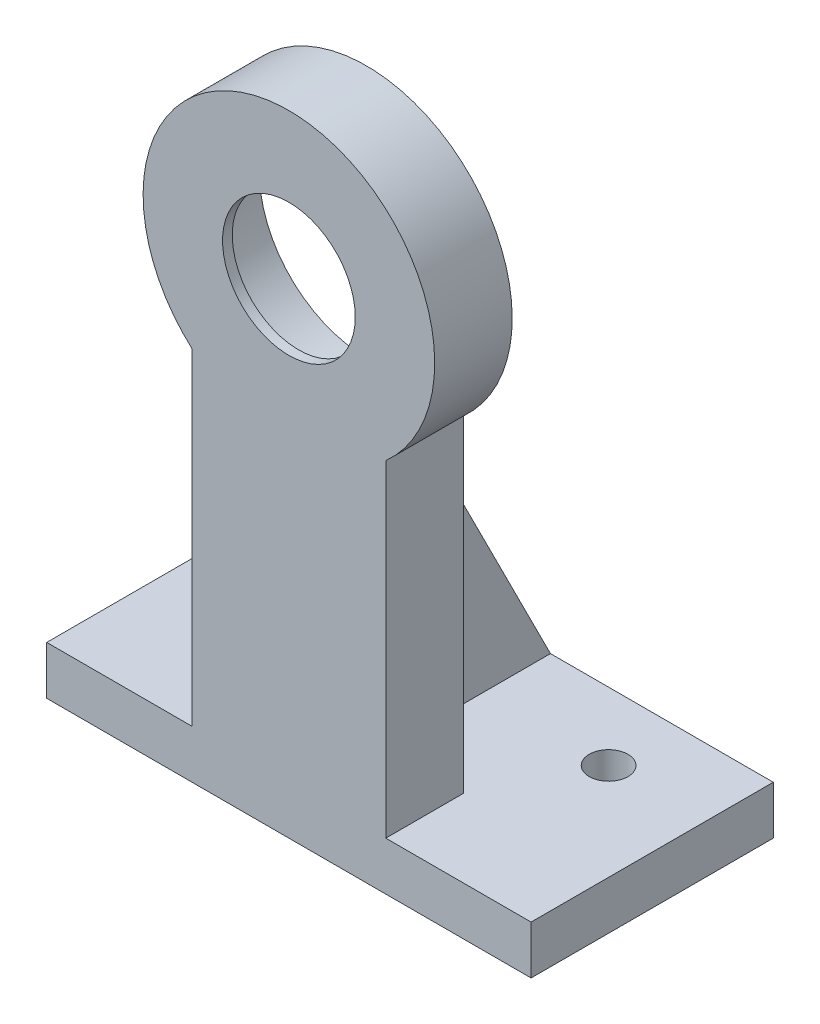
ISO-10303-21;
HEADER;
FILE_DESCRIPTION(('STEP AP214'),'2;1');
FILE_NAME('part.step','',(''),(''),'','','');
FILE_SCHEMA(('AUTOMOTIVE_DESIGN { 1 0 10303 214 1 1 1 1 }'));
ENDSEC;
DATA;
#1=APPLICATION_CONTEXT('core data for automotive mechanical design processes');
#2=APPLICATION_PROTOCOL_DEFINITION('international standard','automotive_design',2000,#1);
#3=PRODUCT_CONTEXT('',#1,'mechanical');
#4=PRODUCT('Part','Part','',(#3));
#5=PRODUCT_RELATED_PRODUCT_CATEGORY('part','',(#4));
#6=PRODUCT_DEFINITION_FORMATION('','',#4);
#7=PRODUCT_DEFINITION_CONTEXT('part definition',#1,'design');
#8=PRODUCT_DEFINITION('design','',#6,#7);
#9=PRODUCT_DEFINITION_SHAPE('','',#8);
#10=(LENGTH_UNIT() NAMED_UNIT(*) SI_UNIT(.MILLI.,.METRE.));
#11=(NAMED_UNIT(*) PLANE_ANGLE_UNIT() SI_UNIT($,.RADIAN.));
#12=(NAMED_UNIT(*) SI_UNIT($,.STERADIAN.) SOLID_ANGLE_UNIT());
#13=UNCERTAINTY_MEASURE_WITH_UNIT(LENGTH_MEASURE(1.E-05),#10,'distance_accuracy_value','');
#14=(GEOMETRIC_REPRESENTATION_CONTEXT(3) GLOBAL_UNCERTAINTY_ASSIGNED_CONTEXT((#13)) GLOBAL_UNIT_ASSIGNED_CONTEXT((#10,
#11,#12)) REPRESENTATION_CONTEXT('',''));
#15=CARTESIAN_POINT('',(0.,0.,0.));
#16=DIRECTION('',(0.,0.,1.));
#17=DIRECTION('',(1.,0.,0.));
#18=AXIS2_PLACEMENT_3D('',#15,#16,#17);
#19=CARTESIAN_POINT('',(0.,0.,0.));
#20=DIRECTION('',(0.,0.,1.));
#21=DIRECTION('',(1.,0.,0.));
#22=AXIS2_PLACEMENT_3D('',#19,#20,#21);
#23=PLANE('',#22);
#24=CARTESIAN_POINT('',(0.,0.,0.));
#25=DIRECTION('',(0.,0.,1.));
#26=DIRECTION('',(1.,0.,0.));
#27=AXIS2_PLACEMENT_3D('',#24,#25,#26);
#28=CIRCLE('',#27,11.05);
#29=CARTESIAN_POINT('',(11.05,0.,0.));
#30=VERTEX_POINT('',#29);
#31=EDGE_CURVE('E152',#30,#30,#28,.T.);
#32=ORIENTED_EDGE('',*,*,#31,.T.);
#33=EDGE_LOOP('',(#32));
#34=FACE_BOUND('',#33,.T.);
#35=DIRECTION('',(0.,-1.,0.));
#36=VECTOR('',#35,1.);
#37=CARTESIAN_POINT('',(-2.,-45.,0.));
#38=LINE('',#37,#36);
#39=CARTESIAN_POINT('',(-2.,-11.247333017209,0.));
#40=VERTEX_POINT('',#39);
#41=CARTESIAN_POINT('',(-2.,-45.,0.));
#42=VERTEX_POINT('',#41);
#43=EDGE_CURVE('E276',#40,#42,#38,.T.);
#44=ORIENTED_EDGE('',*,*,#43,.T.);
#45=DIRECTION('',(-1.,0.,0.));
#46=VECTOR('',#45,1.);
#47=CARTESIAN_POINT('',(0.,-45.,0.));
#48=LINE('',#47,#46);
#49=CARTESIAN_POINT('',(-9.99999999999999,-45.,0.));
#50=VERTEX_POINT('',#49);
#51=EDGE_CURVE('E63',#42,#50,#48,.T.);
#52=ORIENTED_EDGE('',*,*,#51,.T.);
#53=DIRECTION('',(0.,-1.,0.));
#54=VECTOR('',#53,1.);
#55=CARTESIAN_POINT('',(-10.,0.,0.));
#56=LINE('',#55,#54);
#57=CARTESIAN_POINT('',(-10.,-11.247333017209,0.));
#58=VERTEX_POINT('',#57);
#59=EDGE_CURVE('E191',#58,#50,#56,.T.);
#60=ORIENTED_EDGE('',*,*,#59,.F.);
#61=CARTESIAN_POINT('',(0.,0.,0.));
#62=DIRECTION('',(0.,0.,1.));
#63=DIRECTION('',(1.,0.,0.));
#64=AXIS2_PLACEMENT_3D('',#61,#62,#63);
#65=CIRCLE('',#64,15.05);
#66=CARTESIAN_POINT('',(10.,-11.247333017209,0.));
#67=VERTEX_POINT('',#66);
#68=EDGE_CURVE('E166',#67,#58,#65,.T.);
#69=ORIENTED_EDGE('',*,*,#68,.F.);
#70=DIRECTION('',(0.,-1.,0.));
#71=VECTOR('',#70,1.);
#72=CARTESIAN_POINT('',(10.,0.,0.));
#73=LINE('',#72,#71);
#74=CARTESIAN_POINT('',(10.,-45.,0.));
#75=VERTEX_POINT('',#74);
#76=EDGE_CURVE('E146',#67,#75,#73,.T.);
#77=ORIENTED_EDGE('',*,*,#76,.T.);
#78=CARTESIAN_POINT('',(2.,-45.,0.));
#79=VERTEX_POINT('',#78);
#80=EDGE_CURVE('E137',#75,#79,#48,.T.);
#81=ORIENTED_EDGE('',*,*,#80,.T.);
#82=DIRECTION('',(0.,-1.,0.));
#83=VECTOR('',#82,1.);
#84=CARTESIAN_POINT('',(2.,-45.,0.));
#85=LINE('',#84,#83);
#86=CARTESIAN_POINT('',(2.,-11.247333017209,0.));
#87=VERTEX_POINT('',#86);
#88=EDGE_CURVE('E123',#87,#79,#85,.T.);
#89=ORIENTED_EDGE('',*,*,#88,.F.);
#90=DIRECTION('',(1.,0.,0.));
#91=VECTOR('',#90,1.);
#92=CARTESIAN_POINT('',(-2.,-11.247333017209,0.));
#93=LINE('',#92,#91);
#94=EDGE_CURVE('E286',#40,#87,#93,.T.);
#95=ORIENTED_EDGE('',*,*,#94,.F.);
#96=EDGE_LOOP('',(#44,#52,#60,#69,#77,#81,#89,#95));
#97=FACE_BOUND('',#96,.T.);
#98=ADVANCED_FACE('F39',(#34,#97),#23,.F.);
#99=CARTESIAN_POINT('',(0.,-45.,0.));
#100=DIRECTION('',(0.,1.,0.));
#101=DIRECTION('',(-1.,0.,0.));
#102=AXIS2_PLACEMENT_3D('',#99,#100,#101);
#103=PLANE('',#102);
#104=CARTESIAN_POINT('',(-15.,-45.,-10.));
#105=DIRECTION('',(0.,-1.,0.));
#106=DIRECTION('',(1.,0.,0.));
#107=AXIS2_PLACEMENT_3D('',#104,#105,#106);
#108=CIRCLE('',#107,2.);
#109=CARTESIAN_POINT('',(-13.,-45.,-10.));
#110=VERTEX_POINT('',#109);
#111=EDGE_CURVE('E242',#110,#110,#108,.T.);
#112=ORIENTED_EDGE('',*,*,#111,.T.);
#113=EDGE_LOOP('',(#112));
#114=FACE_BOUND('',#113,.T.);
#115=ORIENTED_EDGE('',*,*,#51,.F.);
#116=DIRECTION('',(0.,0.,-1.));
#117=VECTOR('',#116,1.);
#118=CARTESIAN_POINT('',(-2.,-45.,-17.));
#119=LINE('',#118,#117);
#120=CARTESIAN_POINT('',(-2.,-45.,-17.));
#121=VERTEX_POINT('',#120);
#122=EDGE_CURVE('E270',#42,#121,#119,.T.);
#123=ORIENTED_EDGE('',*,*,#122,.T.);
#124=DIRECTION('',(1.,0.,0.));
#125=VECTOR('',#124,1.);
#126=CARTESIAN_POINT('',(25.,-45.,-17.));
#127=LINE('',#126,#125);
#128=CARTESIAN_POINT('',(-25.,-45.,-17.));
#129=VERTEX_POINT('',#128);
#130=EDGE_CURVE('E226',#129,#121,#127,.T.);
#131=ORIENTED_EDGE('',*,*,#130,.F.);
#132=DIRECTION('',(0.,0.,-1.));
#133=VECTOR('',#132,1.);
#134=CARTESIAN_POINT('',(-25.,-45.,7.99999999999998));
#135=LINE('',#134,#133);
#136=CARTESIAN_POINT('',(-25.,-45.,7.99999999999998));
#137=VERTEX_POINT('',#136);
#138=EDGE_CURVE('E235',#137,#129,#135,.T.);
#139=ORIENTED_EDGE('',*,*,#138,.F.);
#140=DIRECTION('',(-1.,0.,0.));
#141=VECTOR('',#140,1.);
#142=CARTESIAN_POINT('',(25.,-45.,7.99999999999999));
#143=LINE('',#142,#141);
#144=CARTESIAN_POINT('',(-9.99999999999999,-45.,8.));
#145=VERTEX_POINT('',#144);
#146=EDGE_CURVE('E251',#145,#137,#143,.T.);
#147=ORIENTED_EDGE('',*,*,#146,.F.);
#148=DIRECTION('',(0.,0.,1.));
#149=VECTOR('',#148,1.);
#150=CARTESIAN_POINT('',(-9.99999999999999,-45.,8.));
#151=LINE('',#150,#149);
#152=EDGE_CURVE('E148',#50,#145,#151,.T.);
#153=ORIENTED_EDGE('',*,*,#152,.F.);
#154=EDGE_LOOP('',(#115,#123,#131,#139,#147,#153));
#155=FACE_BOUND('',#154,.T.);
#156=ADVANCED_FACE('F269',(#114,#155),#103,.T.);
#157=CARTESIAN_POINT('',(0.,0.,8.));
#158=DIRECTION('',(0.,0.,-1.));
#159=DIRECTION('',(-1.,0.,0.));
#160=AXIS2_PLACEMENT_3D('',#157,#158,#159);
#161=CYLINDRICAL_SURFACE('',#160,15.05);
#162=ORIENTED_EDGE('',*,*,#68,.T.);
#163=DIRECTION('',(0.,0.,-1.));
#164=VECTOR('',#163,1.);
#165=CARTESIAN_POINT('',(-10.,-11.247333017209,8.));
#166=LINE('',#165,#164);
#167=CARTESIAN_POINT('',(-10.,-11.247333017209,8.));
#168=VERTEX_POINT('',#167);
#169=EDGE_CURVE('E11',#168,#58,#166,.T.);
#170=ORIENTED_EDGE('',*,*,#169,.F.);
#171=CARTESIAN_POINT('',(0.,0.,8.));
#172=DIRECTION('',(0.,0.,1.));
#173=DIRECTION('',(1.,0.,0.));
#174=AXIS2_PLACEMENT_3D('',#171,#172,#173);
#175=CIRCLE('',#174,15.05);
#176=CARTESIAN_POINT('',(10.,-11.247333017209,8.));
#177=VERTEX_POINT('',#176);
#178=EDGE_CURVE('E174',#177,#168,#175,.T.);
#179=ORIENTED_EDGE('',*,*,#178,.F.);
#180=DIRECTION('',(0.,0.,-1.));
#181=VECTOR('',#180,1.);
#182=CARTESIAN_POINT('',(10.,-11.247333017209,8.));
#183=LINE('',#182,#181);
#184=EDGE_CURVE('E48',#177,#67,#183,.T.);
#185=ORIENTED_EDGE('',*,*,#184,.T.);
#186=EDGE_LOOP('',(#162,#170,#179,#185));
#187=FACE_BOUND('',#186,.T.);
#188=ADVANCED_FACE('F198',(#187),#161,.T.);
#189=CARTESIAN_POINT('',(-10.,0.,8.));
#190=DIRECTION('',(1.,0.,0.));
#191=DIRECTION('',(0.,1.,0.));
#192=AXIS2_PLACEMENT_3D('',#189,#190,#191);
#193=PLANE('',#192);
#194=ORIENTED_EDGE('',*,*,#59,.T.);
#195=ORIENTED_EDGE('',*,*,#152,.T.);
#196=DIRECTION('',(0.,-1.,0.));
#197=VECTOR('',#196,1.);
#198=CARTESIAN_POINT('',(-10.,0.,8.));
#199=LINE('',#198,#197);
#200=EDGE_CURVE('E178',#168,#145,#199,.T.);
#201=ORIENTED_EDGE('',*,*,#200,.F.);
#202=ORIENTED_EDGE('',*,*,#169,.T.);
#203=EDGE_LOOP('',(#194,#195,#201,#202));
#204=FACE_BOUND('',#203,.T.);
#205=ADVANCED_FACE('F310',(#204),#193,.F.);
#206=CARTESIAN_POINT('',(0.,-50.,8.));
#207=DIRECTION('',(0.,1.,0.));
#208=DIRECTION('',(-1.,0.,0.));
#209=AXIS2_PLACEMENT_3D('',#206,#207,#208);
#210=PLANE('',#209);
#211=DIRECTION('',(1.,0.,0.));
#212=VECTOR('',#211,1.);
#213=CARTESIAN_POINT('',(0.,-50.,8.));
#214=LINE('',#213,#212);
#215=CARTESIAN_POINT('',(-25.,-50.,7.99999999999998));
#216=VERTEX_POINT('',#215);
#217=CARTESIAN_POINT('',(25.,-50.,7.99999999999999));
#218=VERTEX_POINT('',#217);
#219=EDGE_CURVE('E182',#216,#218,#214,.T.);
#220=ORIENTED_EDGE('',*,*,#219,.F.);
#221=DIRECTION('',(0.,0.,-1.));
#222=VECTOR('',#221,1.);
#223=CARTESIAN_POINT('',(-25.,-50.,7.99999999999998));
#224=LINE('',#223,#222);
#225=CARTESIAN_POINT('',(-25.,-50.,-17.));
#226=VERTEX_POINT('',#225);
#227=EDGE_CURVE('E241',#216,#226,#224,.T.);
#228=ORIENTED_EDGE('',*,*,#227,.T.);
#229=DIRECTION('',(1.,0.,0.));
#230=VECTOR('',#229,1.);
#231=CARTESIAN_POINT('',(25.,-50.,-17.));
#232=LINE('',#231,#230);
#233=CARTESIAN_POINT('',(25.,-50.,-17.));
#234=VERTEX_POINT('',#233);
#235=EDGE_CURVE('E218',#226,#234,#232,.T.);
#236=ORIENTED_EDGE('',*,*,#235,.T.);
#237=DIRECTION('',(0.,0.,1.));
#238=VECTOR('',#237,1.);
#239=CARTESIAN_POINT('',(25.,-50.,7.99999999999999));
#240=LINE('',#239,#238);
#241=EDGE_CURVE('E239',#234,#218,#240,.T.);
#242=ORIENTED_EDGE('',*,*,#241,.T.);
#243=EDGE_LOOP('',(#220,#228,#236,#242));
#244=FACE_BOUND('',#243,.T.);
#245=CARTESIAN_POINT('',(15.,-50.,-10.));
#246=DIRECTION('',(0.,-1.,0.));
#247=DIRECTION('',(1.,0.,0.));
#248=AXIS2_PLACEMENT_3D('',#245,#246,#247);
#249=CIRCLE('',#248,2.00000000000001);
#250=CARTESIAN_POINT('',(17.,-50.,-10.));
#251=VERTEX_POINT('',#250);
#252=EDGE_CURVE('E289',#251,#251,#249,.T.);
#253=ORIENTED_EDGE('',*,*,#252,.F.);
#254=EDGE_LOOP('',(#253));
#255=FACE_BOUND('',#254,.T.);
#256=CARTESIAN_POINT('',(-15.,-50.,-10.));
#257=DIRECTION('',(0.,-1.,0.));
#258=DIRECTION('',(1.,0.,0.));
#259=AXIS2_PLACEMENT_3D('',#256,#257,#258);
#260=CIRCLE('',#259,2.);
#261=CARTESIAN_POINT('',(-13.,-50.,-10.));
#262=VERTEX_POINT('',#261);
#263=EDGE_CURVE('E256',#262,#262,#260,.T.);
#264=ORIENTED_EDGE('',*,*,#263,.F.);
#265=EDGE_LOOP('',(#264));
#266=FACE_BOUND('',#265,.T.);
#267=ADVANCED_FACE('F308',(#244,#255,#266),#210,.F.);
#268=CARTESIAN_POINT('',(0.,0.,8.));
#269=DIRECTION('',(0.,0.,-1.));
#270=DIRECTION('',(-1.,0.,0.));
#271=AXIS2_PLACEMENT_3D('',#268,#269,#270);
#272=CYLINDRICAL_SURFACE('',#271,6.84796729746906);
#273=CARTESIAN_POINT('',(0.,0.,7.));
#274=DIRECTION('',(0.,0.,1.));
#275=DIRECTION('',(1.,0.,0.));
#276=AXIS2_PLACEMENT_3D('',#273,#274,#275);
#277=CIRCLE('',#276,6.84796729746906);
#278=CARTESIAN_POINT('',(6.84796729746906,0.,7.));
#279=VERTEX_POINT('',#278);
#280=EDGE_CURVE('E162',#279,#279,#277,.T.);
#281=ORIENTED_EDGE('',*,*,#280,.F.);
#282=EDGE_LOOP('',(#281));
#283=FACE_BOUND('',#282,.T.);
#284=CARTESIAN_POINT('',(0.,0.,8.));
#285=DIRECTION('',(0.,0.,1.));
#286=DIRECTION('',(1.,0.,0.));
#287=AXIS2_PLACEMENT_3D('',#284,#285,#286);
#288=CIRCLE('',#287,6.84796729746906);
#289=CARTESIAN_POINT('',(6.84796729746906,0.,8.));
#290=VERTEX_POINT('',#289);
#291=EDGE_CURVE('E170',#290,#290,#288,.T.);
#292=ORIENTED_EDGE('',*,*,#291,.T.);
#293=EDGE_LOOP('',(#292));
#294=FACE_BOUND('',#293,.T.);
#295=ADVANCED_FACE('F41',(#283,#294),#272,.F.);
#296=CARTESIAN_POINT('',(10.,0.,8.));
#297=DIRECTION('',(1.,0.,0.));
#298=DIRECTION('',(0.,1.,0.));
#299=AXIS2_PLACEMENT_3D('',#296,#297,#298);
#300=PLANE('',#299);
#301=DIRECTION('',(0.,0.,1.));
#302=VECTOR('',#301,1.);
#303=CARTESIAN_POINT('',(10.,-45.,8.));
#304=LINE('',#303,#302);
#305=CARTESIAN_POINT('',(10.,-45.,8.));
#306=VERTEX_POINT('',#305);
#307=EDGE_CURVE('E154',#75,#306,#304,.T.);
#308=ORIENTED_EDGE('',*,*,#307,.F.);
#309=ORIENTED_EDGE('',*,*,#76,.F.);
#310=ORIENTED_EDGE('',*,*,#184,.F.);
#311=DIRECTION('',(0.,-1.,0.));
#312=VECTOR('',#311,1.);
#313=CARTESIAN_POINT('',(10.,0.,8.));
#314=LINE('',#313,#312);
#315=EDGE_CURVE('E185',#177,#306,#314,.T.);
#316=ORIENTED_EDGE('',*,*,#315,.T.);
#317=EDGE_LOOP('',(#308,#309,#310,#316));
#318=FACE_BOUND('',#317,.T.);
#319=ADVANCED_FACE('F202',(#318),#300,.T.);
#320=CARTESIAN_POINT('',(0.,0.,8.));
#321=DIRECTION('',(0.,0.,1.));
#322=DIRECTION('',(1.,0.,0.));
#323=AXIS2_PLACEMENT_3D('',#320,#321,#322);
#324=PLANE('',#323);
#325=ORIENTED_EDGE('',*,*,#200,.T.);
#326=ORIENTED_EDGE('',*,*,#146,.T.);
#327=DIRECTION('',(0.,-1.,0.));
#328=VECTOR('',#327,1.);
#329=CARTESIAN_POINT('',(-25.,-45.,7.99999999999998));
#330=LINE('',#329,#328);
#331=EDGE_CURVE('E215',#137,#216,#330,.T.);
#332=ORIENTED_EDGE('',*,*,#331,.T.);
#333=ORIENTED_EDGE('',*,*,#219,.T.);
#334=DIRECTION('',(0.,-1.,0.));
#335=VECTOR('',#334,1.);
#336=CARTESIAN_POINT('',(25.,-45.,7.99999999999999));
#337=LINE('',#336,#335);
#338=CARTESIAN_POINT('',(25.,-45.,7.99999999999999));
#339=VERTEX_POINT('',#338);
#340=EDGE_CURVE('E223',#339,#218,#337,.T.);
#341=ORIENTED_EDGE('',*,*,#340,.F.);
#342=EDGE_CURVE('E254',#339,#306,#143,.T.);
#343=ORIENTED_EDGE('',*,*,#342,.T.);
#344=ORIENTED_EDGE('',*,*,#315,.F.);
#345=ORIENTED_EDGE('',*,*,#178,.T.);
#346=EDGE_LOOP('',(#325,#326,#332,#333,#341,#343,#344,#345));
#347=FACE_BOUND('',#346,.T.);
#348=ORIENTED_EDGE('',*,*,#291,.F.);
#349=EDGE_LOOP('',(#348));
#350=FACE_BOUND('',#349,.T.);
#351=ADVANCED_FACE('F329',(#347,#350),#324,.T.);
#352=CARTESIAN_POINT('',(0.,0.,7.));
#353=DIRECTION('',(0.,0.,-1.));
#354=DIRECTION('',(-1.,0.,0.));
#355=AXIS2_PLACEMENT_3D('',#352,#353,#354);
#356=CYLINDRICAL_SURFACE('',#355,11.05);
#357=CARTESIAN_POINT('',(0.,0.,7.));
#358=DIRECTION('',(0.,0.,1.));
#359=DIRECTION('',(1.,0.,0.));
#360=AXIS2_PLACEMENT_3D('',#357,#358,#359);
#361=CIRCLE('',#360,11.05);
#362=CARTESIAN_POINT('',(11.05,0.,7.));
#363=VERTEX_POINT('',#362);
#364=EDGE_CURVE('E158',#363,#363,#361,.T.);
#365=ORIENTED_EDGE('',*,*,#364,.T.);
#366=EDGE_LOOP('',(#365));
#367=FACE_BOUND('',#366,.T.);
#368=ORIENTED_EDGE('',*,*,#31,.F.);
#369=EDGE_LOOP('',(#368));
#370=FACE_BOUND('',#369,.T.);
#371=ADVANCED_FACE('F335',(#367,#370),#356,.F.);
#372=CARTESIAN_POINT('',(0.,0.,7.));
#373=DIRECTION('',(0.,0.,1.));
#374=DIRECTION('',(1.,0.,0.));
#375=AXIS2_PLACEMENT_3D('',#372,#373,#374);
#376=PLANE('',#375);
#377=ORIENTED_EDGE('',*,*,#364,.F.);
#378=EDGE_LOOP('',(#377));
#379=FACE_BOUND('',#378,.T.);
#380=ORIENTED_EDGE('',*,*,#280,.T.);
#381=EDGE_LOOP('',(#380));
#382=FACE_BOUND('',#381,.T.);
#383=ADVANCED_FACE('F339',(#379,#382),#376,.F.);
#384=DIRECTION('',(0.,0.,-1.));
#385=VECTOR('',#384,1.);
#386=CARTESIAN_POINT('',(2.,-45.,-17.));
#387=LINE('',#386,#385);
#388=CARTESIAN_POINT('',(2.,-45.,-17.));
#389=VERTEX_POINT('',#388);
#390=EDGE_CURVE('E126',#79,#389,#387,.T.);
#391=ORIENTED_EDGE('',*,*,#390,.F.);
#392=ORIENTED_EDGE('',*,*,#80,.F.);
#393=ORIENTED_EDGE('',*,*,#307,.T.);
#394=ORIENTED_EDGE('',*,*,#342,.F.);
#395=DIRECTION('',(0.,0.,1.));
#396=VECTOR('',#395,1.);
#397=CARTESIAN_POINT('',(25.,-45.,7.99999999999999));
#398=LINE('',#397,#396);
#399=CARTESIAN_POINT('',(25.,-45.,-17.));
#400=VERTEX_POINT('',#399);
#401=EDGE_CURVE('E249',#400,#339,#398,.T.);
#402=ORIENTED_EDGE('',*,*,#401,.F.);
#403=EDGE_CURVE('E139',#389,#400,#127,.T.);
#404=ORIENTED_EDGE('',*,*,#403,.F.);
#405=EDGE_LOOP('',(#391,#392,#393,#394,#402,#404));
#406=FACE_BOUND('',#405,.T.);
#407=CARTESIAN_POINT('',(15.,-45.,-10.));
#408=DIRECTION('',(0.,-1.,0.));
#409=DIRECTION('',(1.,0.,0.));
#410=AXIS2_PLACEMENT_3D('',#407,#408,#409);
#411=CIRCLE('',#410,2.00000000000001);
#412=CARTESIAN_POINT('',(17.,-45.,-10.));
#413=VERTEX_POINT('',#412);
#414=EDGE_CURVE('E292',#413,#413,#411,.T.);
#415=ORIENTED_EDGE('',*,*,#414,.T.);
#416=EDGE_LOOP('',(#415));
#417=FACE_BOUND('',#416,.T.);
#418=ADVANCED_FACE('F134',(#406,#417),#103,.T.);
#419=CARTESIAN_POINT('',(25.,-45.,7.99999999999999));
#420=DIRECTION('',(1.,0.,0.));
#421=DIRECTION('',(0.,0.,-1.));
#422=AXIS2_PLACEMENT_3D('',#419,#420,#421);
#423=PLANE('',#422);
#424=ORIENTED_EDGE('',*,*,#241,.F.);
#425=DIRECTION('',(0.,-1.,0.));
#426=VECTOR('',#425,1.);
#427=CARTESIAN_POINT('',(25.,-45.,-17.));
#428=LINE('',#427,#426);
#429=EDGE_CURVE('E206',#400,#234,#428,.T.);
#430=ORIENTED_EDGE('',*,*,#429,.F.);
#431=ORIENTED_EDGE('',*,*,#401,.T.);
#432=ORIENTED_EDGE('',*,*,#340,.T.);
#433=EDGE_LOOP('',(#424,#430,#431,#432));
#434=FACE_BOUND('',#433,.T.);
#435=ADVANCED_FACE('F344',(#434),#423,.T.);
#436=CARTESIAN_POINT('',(25.,-45.,-17.));
#437=DIRECTION('',(0.,0.,-1.));
#438=DIRECTION('',(-1.,0.,0.));
#439=AXIS2_PLACEMENT_3D('',#436,#437,#438);
#440=PLANE('',#439);
#441=ORIENTED_EDGE('',*,*,#235,.F.);
#442=DIRECTION('',(0.,-1.,0.));
#443=VECTOR('',#442,1.);
#444=CARTESIAN_POINT('',(-25.,-45.,-17.));
#445=LINE('',#444,#443);
#446=EDGE_CURVE('E208',#129,#226,#445,.T.);
#447=ORIENTED_EDGE('',*,*,#446,.F.);
#448=ORIENTED_EDGE('',*,*,#130,.T.);
#449=DIRECTION('',(1.,0.,0.));
#450=VECTOR('',#449,1.);
#451=CARTESIAN_POINT('',(-2.,-45.,-17.));
#452=LINE('',#451,#450);
#453=EDGE_CURVE('E281',#121,#389,#452,.T.);
#454=ORIENTED_EDGE('',*,*,#453,.T.);
#455=ORIENTED_EDGE('',*,*,#403,.T.);
#456=ORIENTED_EDGE('',*,*,#429,.T.);
#457=EDGE_LOOP('',(#441,#447,#448,#454,#455,#456));
#458=FACE_BOUND('',#457,.T.);
#459=ADVANCED_FACE('F346',(#458),#440,.T.);
#460=CARTESIAN_POINT('',(-25.,-45.,7.99999999999998));
#461=DIRECTION('',(-1.,0.,0.));
#462=DIRECTION('',(0.,-1.,0.));
#463=AXIS2_PLACEMENT_3D('',#460,#461,#462);
#464=PLANE('',#463);
#465=ORIENTED_EDGE('',*,*,#227,.F.);
#466=ORIENTED_EDGE('',*,*,#331,.F.);
#467=ORIENTED_EDGE('',*,*,#138,.T.);
#468=ORIENTED_EDGE('',*,*,#446,.T.);
#469=EDGE_LOOP('',(#465,#466,#467,#468));
#470=FACE_BOUND('',#469,.T.);
#471=ADVANCED_FACE('F265',(#470),#464,.T.);
#472=CARTESIAN_POINT('',(-15.,-45.,-10.));
#473=DIRECTION('',(0.,-1.,0.));
#474=DIRECTION('',(1.,0.,0.));
#475=AXIS2_PLACEMENT_3D('',#472,#473,#474);
#476=CYLINDRICAL_SURFACE('',#475,2.);
#477=ORIENTED_EDGE('',*,*,#111,.F.);
#478=EDGE_LOOP('',(#477));
#479=FACE_BOUND('',#478,.T.);
#480=ORIENTED_EDGE('',*,*,#263,.T.);
#481=EDGE_LOOP('',(#480));
#482=FACE_BOUND('',#481,.T.);
#483=ADVANCED_FACE('F306',(#479,#482),#476,.F.);
#484=CARTESIAN_POINT('',(15.,-45.,-10.));
#485=DIRECTION('',(0.,-1.,0.));
#486=DIRECTION('',(1.,0.,0.));
#487=AXIS2_PLACEMENT_3D('',#484,#485,#486);
#488=CYLINDRICAL_SURFACE('',#487,2.00000000000001);
#489=ORIENTED_EDGE('',*,*,#414,.F.);
#490=EDGE_LOOP('',(#489));
#491=FACE_BOUND('',#490,.T.);
#492=ORIENTED_EDGE('',*,*,#252,.T.);
#493=EDGE_LOOP('',(#492));
#494=FACE_BOUND('',#493,.T.);
#495=ADVANCED_FACE('F395',(#491,#494),#488,.F.);
#496=CARTESIAN_POINT('',(-2.,-11.247333017209,0.));
#497=DIRECTION('',(0.,0.44982950800452,-0.893114446041722));
#498=DIRECTION('',(0.,0.893114446041722,0.44982950800452));
#499=AXIS2_PLACEMENT_3D('',#496,#497,#498);
#500=PLANE('',#499);
#501=ORIENTED_EDGE('',*,*,#94,.T.);
#502=DIRECTION('',(0.,0.893114446041722,0.44982950800452));
#503=VECTOR('',#502,1.);
#504=CARTESIAN_POINT('',(2.,-11.247333017209,0.));
#505=LINE('',#504,#503);
#506=EDGE_CURVE('E55',#389,#87,#505,.T.);
#507=ORIENTED_EDGE('',*,*,#506,.F.);
#508=ORIENTED_EDGE('',*,*,#453,.F.);
#509=DIRECTION('',(0.,0.893114446041722,0.44982950800452));
#510=VECTOR('',#509,1.);
#511=CARTESIAN_POINT('',(-2.,-11.247333017209,0.));
#512=LINE('',#511,#510);
#513=EDGE_CURVE('E275',#121,#40,#512,.T.);
#514=ORIENTED_EDGE('',*,*,#513,.T.);
#515=EDGE_LOOP('',(#501,#507,#508,#514));
#516=FACE_BOUND('',#515,.T.);
#517=ADVANCED_FACE('F389',(#516),#500,.T.);
#518=CARTESIAN_POINT('',(-2.,0.,0.));
#519=DIRECTION('',(1.,0.,0.));
#520=DIRECTION('',(0.,0.,-1.));
#521=AXIS2_PLACEMENT_3D('',#518,#519,#520);
#522=PLANE('',#521);
#523=ORIENTED_EDGE('',*,*,#43,.F.);
#524=ORIENTED_EDGE('',*,*,#513,.F.);
#525=ORIENTED_EDGE('',*,*,#122,.F.);
#526=EDGE_LOOP('',(#523,#524,#525));
#527=FACE_BOUND('',#526,.T.);
#528=ADVANCED_FACE('F394',(#527),#522,.F.);
#529=CARTESIAN_POINT('',(2.,0.,0.));
#530=DIRECTION('',(1.,0.,0.));
#531=DIRECTION('',(0.,0.,-1.));
#532=AXIS2_PLACEMENT_3D('',#529,#530,#531);
#533=PLANE('',#532);
#534=ORIENTED_EDGE('',*,*,#88,.T.);
#535=ORIENTED_EDGE('',*,*,#390,.T.);
#536=ORIENTED_EDGE('',*,*,#506,.T.);
#537=EDGE_LOOP('',(#534,#535,#536));
#538=FACE_BOUND('',#537,.T.);
#539=ADVANCED_FACE('F125',(#538),#533,.T.);
#540=CLOSED_SHELL('',(#98,#156,#188,#205,#267,#295,#319,#351,#371,#383,#418,#435,#459,#471,#483,
#495,#517,#528,#539));
#541=MANIFOLD_SOLID_BREP('B2',#540);
#542=ADVANCED_BREP_SHAPE_REPRESENTATION('',(#18,#541),#14);
#543=SHAPE_DEFINITION_REPRESENTATION(#9,#542);
ENDSEC;
END-ISO-10303-21;
